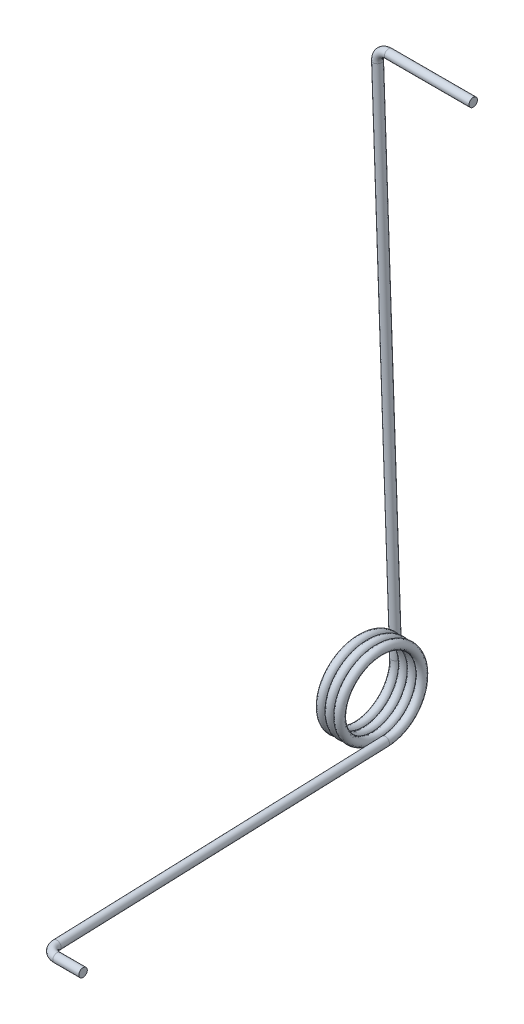
ISO-10303-21;
HEADER;
FILE_DESCRIPTION(('STEP AP214'),'2;1');
FILE_NAME('part.step','',(''),(''),'','','');
FILE_SCHEMA(('AUTOMOTIVE_DESIGN { 1 0 10303 214 1 1 1 1 }'));
ENDSEC;
DATA;
#1=APPLICATION_CONTEXT('core data for automotive mechanical design processes');
#2=APPLICATION_PROTOCOL_DEFINITION('international standard','automotive_design',2000,#1);
#3=PRODUCT_CONTEXT('',#1,'mechanical');
#4=PRODUCT('Part','Part','',(#3));
#5=PRODUCT_RELATED_PRODUCT_CATEGORY('part','',(#4));
#6=PRODUCT_DEFINITION_FORMATION('','',#4);
#7=PRODUCT_DEFINITION_CONTEXT('part definition',#1,'design');
#8=PRODUCT_DEFINITION('design','',#6,#7);
#9=PRODUCT_DEFINITION_SHAPE('','',#8);
#10=(LENGTH_UNIT() NAMED_UNIT(*) SI_UNIT(.MILLI.,.METRE.));
#11=(NAMED_UNIT(*) PLANE_ANGLE_UNIT() SI_UNIT($,.RADIAN.));
#12=(NAMED_UNIT(*) SI_UNIT($,.STERADIAN.) SOLID_ANGLE_UNIT());
#13=UNCERTAINTY_MEASURE_WITH_UNIT(LENGTH_MEASURE(1.E-05),#10,'distance_accuracy_value','');
#14=(GEOMETRIC_REPRESENTATION_CONTEXT(3) GLOBAL_UNCERTAINTY_ASSIGNED_CONTEXT((#13)) GLOBAL_UNIT_ASSIGNED_CONTEXT((#10,
#11,#12)) REPRESENTATION_CONTEXT('',''));
#15=CARTESIAN_POINT('',(0.,0.,0.));
#16=DIRECTION('',(0.,0.,1.));
#17=DIRECTION('',(1.,0.,0.));
#18=AXIS2_PLACEMENT_3D('',#15,#16,#17);
#19=CARTESIAN_POINT('',(0.48229322917672,0.0172046822200336,-4.4196));
#20=CARTESIAN_POINT('',(0.564843229176719,-2.53445256749044,-4.42953312791106));
#21=CARTESIAN_POINT('',(0.647393229176719,-3.81888353345569,-2.22469969186659));
#22=CARTESIAN_POINT('',(0.729943229176719,-5.10331449942094,-0.0198662558221171));
#23=CARTESIAN_POINT('',(0.812493229176719,-3.83608821567572,2.19490030813341));
#24=CARTESIAN_POINT('',(0.895043229176719,-2.56886193193051,4.40966687208894));
#25=CARTESIAN_POINT('',(0.977593229176719,-0.0172046822200342,4.4196));
#26=CARTESIAN_POINT('',(1.06014322917672,2.53445256749044,4.42953312791106));
#27=CARTESIAN_POINT('',(1.14269322917672,3.81888353345569,2.22469969186659));
#28=CARTESIAN_POINT('',(1.22524322917672,5.10331449942094,0.0198662558221177));
#29=CARTESIAN_POINT('',(1.30779322917672,3.83608821567572,-2.19490030813341));
#30=CARTESIAN_POINT('',(1.39034322917672,2.56886193193051,-4.40966687208894));
#31=CARTESIAN_POINT('',(1.47289322917672,0.0172046822200336,-4.4196));
#32=CARTESIAN_POINT('',(1.55544322917672,-2.53445256749044,-4.42953312791106));
#33=CARTESIAN_POINT('',(1.63799322917672,-3.81888353345569,-2.22469969186659));
#34=CARTESIAN_POINT('',(1.72054322917672,-5.10331449942094,-0.0198662558221171));
#35=CARTESIAN_POINT('',(1.80309322917672,-3.83608821567572,2.19490030813341));
#36=CARTESIAN_POINT('',(1.88564322917672,-2.56886193193051,4.40966687208894));
#37=CARTESIAN_POINT('',(1.96819322917672,-0.0172046822200342,4.4196));
#38=CARTESIAN_POINT('',(2.05074322917672,2.53445256749044,4.42953312791106));
#39=CARTESIAN_POINT('',(2.13329322917672,3.81888353345569,2.22469969186659));
#40=CARTESIAN_POINT('',(2.21584322917672,5.10331449942094,0.0198662558221177));
#41=CARTESIAN_POINT('',(2.29839322917672,3.83608821567572,-2.19490030813341));
#42=CARTESIAN_POINT('',(2.38094322917671,2.56886193193051,-4.40966687208894));
#43=CARTESIAN_POINT('',(2.46349322917672,0.0172046822200336,-4.4196));
#44=CARTESIAN_POINT('',(2.54604322917671,-2.53445256749044,-4.42953312791106));
#45=CARTESIAN_POINT('',(2.62859322917671,-3.81888353345569,-2.22469969186659));
#46=CARTESIAN_POINT('',(2.71114322917671,-5.10331449942094,-0.0198662558221171));
#47=CARTESIAN_POINT('',(2.79369322917671,-3.83608821567572,2.19490030813341));
#48=CARTESIAN_POINT('',(2.87624322917671,-2.56886193193051,4.40966687208894));
#49=CARTESIAN_POINT('',(2.95879322917671,-0.0172046822200342,4.4196));
#50=CARTESIAN_POINT('',(3.04134322917671,2.53445256749044,4.42953312791106));
#51=CARTESIAN_POINT('',(3.12389322917671,3.81888353345569,2.22469969186659));
#52=CARTESIAN_POINT('',(3.20644322917671,5.10331449942094,0.0198662558221177));
#53=CARTESIAN_POINT('',(3.28899322917671,3.83608821567572,-2.19490030813341));
#54=CARTESIAN_POINT('',(3.37154322917671,2.56886193193051,-4.40966687208894));
#55=CARTESIAN_POINT('',(3.45409322917671,0.0172046822200336,-4.4196));
#56=CARTESIAN_POINT('',(3.53664322917671,-2.53445256749044,-4.42953312791106));
#57=CARTESIAN_POINT('',(3.61919322917671,-3.81888353345569,-2.22469969186659));
#58=CARTESIAN_POINT('',(3.70174322917671,-5.10331449942094,-0.0198662558221171));
#59=CARTESIAN_POINT('',(3.78429322917671,-3.83608821567572,2.19490030813341));
#60=CARTESIAN_POINT('',(3.86684322917671,-2.56886193193051,4.40966687208894));
#61=CARTESIAN_POINT('',(3.94939322917671,-0.0172046822200342,4.4196));
#62=CARTESIAN_POINT('',(4.03194322917671,2.53445256749044,4.42953312791106));
#63=CARTESIAN_POINT('',(4.11449322917671,3.81888353345569,2.22469969186659));
#64=CARTESIAN_POINT('',(4.19704322917671,5.10331449942094,0.0198662558221177));
#65=CARTESIAN_POINT('',(4.27959322917671,3.83608821567572,-2.19490030813341));
#66=CARTESIAN_POINT('',(4.36214322917671,2.56886193193051,-4.40966687208894));
#67=CARTESIAN_POINT('',(4.44469322917671,0.0172046822200336,-4.4196));
#68=CARTESIAN_POINT('',(0.48229322917672,0.0172046822200336,-3.4544));
#69=CARTESIAN_POINT('',(0.564843229176719,-1.97719408766861,-3.46433312791106));
#70=CARTESIAN_POINT('',(0.647393229176719,-2.98299581372295,-1.74209969186659));
#71=CARTESIAN_POINT('',(0.729943229176719,-3.98879753977729,-0.019866255822117));
#72=CARTESIAN_POINT('',(0.812493229176719,-3.00020049594298,1.71230030813341));
#73=CARTESIAN_POINT('',(0.895043229176719,-2.01160345210868,3.44446687208894));
#74=CARTESIAN_POINT('',(0.977593229176719,-0.0172046822200341,3.4544));
#75=CARTESIAN_POINT('',(1.06014322917672,1.97719408766861,3.46433312791106));
#76=CARTESIAN_POINT('',(1.14269322917672,2.98299581372295,1.74209969186659));
#77=CARTESIAN_POINT('',(1.22524322917672,3.98879753977729,0.0198662558221175));
#78=CARTESIAN_POINT('',(1.30779322917672,3.00020049594298,-1.71230030813341));
#79=CARTESIAN_POINT('',(1.39034322917672,2.01160345210868,-3.44446687208894));
#80=CARTESIAN_POINT('',(1.47289322917672,0.0172046822200336,-3.4544));
#81=CARTESIAN_POINT('',(1.55544322917672,-1.97719408766861,-3.46433312791106));
#82=CARTESIAN_POINT('',(1.63799322917672,-2.98299581372295,-1.74209969186659));
#83=CARTESIAN_POINT('',(1.72054322917672,-3.98879753977729,-0.019866255822117));
#84=CARTESIAN_POINT('',(1.80309322917672,-3.00020049594298,1.71230030813341));
#85=CARTESIAN_POINT('',(1.88564322917672,-2.01160345210868,3.44446687208894));
#86=CARTESIAN_POINT('',(1.96819322917672,-0.0172046822200341,3.4544));
#87=CARTESIAN_POINT('',(2.05074322917672,1.97719408766861,3.46433312791106));
#88=CARTESIAN_POINT('',(2.13329322917672,2.98299581372295,1.74209969186659));
#89=CARTESIAN_POINT('',(2.21584322917672,3.98879753977729,0.0198662558221175));
#90=CARTESIAN_POINT('',(2.29839322917672,3.00020049594298,-1.71230030813341));
#91=CARTESIAN_POINT('',(2.38094322917672,2.01160345210868,-3.44446687208894));
#92=CARTESIAN_POINT('',(2.46349322917672,0.0172046822200336,-3.4544));
#93=CARTESIAN_POINT('',(2.54604322917671,-1.97719408766861,-3.46433312791106));
#94=CARTESIAN_POINT('',(2.62859322917671,-2.98299581372295,-1.74209969186659));
#95=CARTESIAN_POINT('',(2.71114322917671,-3.98879753977729,-0.019866255822117));
#96=CARTESIAN_POINT('',(2.79369322917671,-3.00020049594298,1.71230030813341));
#97=CARTESIAN_POINT('',(2.87624322917671,-2.01160345210868,3.44446687208894));
#98=CARTESIAN_POINT('',(2.95879322917671,-0.0172046822200341,3.4544));
#99=CARTESIAN_POINT('',(3.04134322917671,1.97719408766861,3.46433312791106));
#100=CARTESIAN_POINT('',(3.12389322917671,2.98299581372295,1.74209969186659));
#101=CARTESIAN_POINT('',(3.20644322917671,3.98879753977729,0.0198662558221175));
#102=CARTESIAN_POINT('',(3.28899322917671,3.00020049594298,-1.71230030813341));
#103=CARTESIAN_POINT('',(3.37154322917671,2.01160345210868,-3.44446687208894));
#104=CARTESIAN_POINT('',(3.45409322917671,0.0172046822200336,-3.4544));
#105=CARTESIAN_POINT('',(3.53664322917671,-1.97719408766861,-3.46433312791106));
#106=CARTESIAN_POINT('',(3.61919322917671,-2.98299581372295,-1.74209969186659));
#107=CARTESIAN_POINT('',(3.70174322917671,-3.98879753977729,-0.019866255822117));
#108=CARTESIAN_POINT('',(3.78429322917671,-3.00020049594298,1.71230030813341));
#109=CARTESIAN_POINT('',(3.86684322917671,-2.01160345210868,3.44446687208894));
#110=CARTESIAN_POINT('',(3.94939322917671,-0.0172046822200341,3.4544));
#111=CARTESIAN_POINT('',(4.03194322917671,1.97719408766861,3.46433312791106));
#112=CARTESIAN_POINT('',(4.11449322917671,2.98299581372295,1.74209969186659));
#113=CARTESIAN_POINT('',(4.19704322917671,3.98879753977729,0.0198662558221175));
#114=CARTESIAN_POINT('',(4.27959322917671,3.00020049594298,-1.71230030813341));
#115=CARTESIAN_POINT('',(4.36214322917671,2.01160345210868,-3.44446687208894));
#116=CARTESIAN_POINT('',(4.44469322917671,0.0172046822200336,-3.4544));
#117=CARTESIAN_POINT('',(-0.482293229176719,-0.0172046822200336,-3.4544));
#118=CARTESIAN_POINT('',(-0.39974322917672,-2.01160345210868,-3.44446687208894));
#119=CARTESIAN_POINT('',(-0.31719322917672,-3.00020049594298,-1.71230030813341));
#120=CARTESIAN_POINT('',(-0.23464322917672,-3.98879753977729,0.0198662558221165));
#121=CARTESIAN_POINT('',(-0.15209322917672,-2.98299581372295,1.74209969186659));
#122=CARTESIAN_POINT('',(-0.0695432291767204,-1.97719408766861,3.46433312791106));
#123=CARTESIAN_POINT('',(0.0130067708232794,0.0172046822200332,3.4544));
#124=CARTESIAN_POINT('',(0.0955567708232792,2.01160345210868,3.44446687208894));
#125=CARTESIAN_POINT('',(0.178106770823279,3.00020049594298,1.71230030813341));
#126=CARTESIAN_POINT('',(0.260656770823279,3.98879753977729,-0.0198662558221161));
#127=CARTESIAN_POINT('',(0.343206770823279,2.98299581372295,-1.74209969186659));
#128=CARTESIAN_POINT('',(0.425756770823279,1.97719408766861,-3.46433312791106));
#129=CARTESIAN_POINT('',(0.508306770823278,-0.0172046822200336,-3.4544));
#130=CARTESIAN_POINT('',(0.590856770823278,-2.01160345210868,-3.44446687208894));
#131=CARTESIAN_POINT('',(0.673406770823278,-3.00020049594298,-1.71230030813341));
#132=CARTESIAN_POINT('',(0.755956770823278,-3.98879753977729,0.0198662558221165));
#133=CARTESIAN_POINT('',(0.838506770823278,-2.98299581372295,1.74209969186659));
#134=CARTESIAN_POINT('',(0.921056770823277,-1.97719408766861,3.46433312791106));
#135=CARTESIAN_POINT('',(1.00360677082328,0.0172046822200332,3.4544));
#136=CARTESIAN_POINT('',(1.08615677082328,2.01160345210868,3.44446687208894));
#137=CARTESIAN_POINT('',(1.16870677082328,3.00020049594298,1.71230030813341));
#138=CARTESIAN_POINT('',(1.25125677082328,3.98879753977729,-0.0198662558221161));
#139=CARTESIAN_POINT('',(1.33380677082328,2.98299581372295,-1.74209969186659));
#140=CARTESIAN_POINT('',(1.41635677082328,1.97719408766861,-3.46433312791106));
#141=CARTESIAN_POINT('',(1.49890677082328,-0.0172046822200336,-3.4544));
#142=CARTESIAN_POINT('',(1.58145677082328,-2.01160345210868,-3.44446687208894));
#143=CARTESIAN_POINT('',(1.66400677082328,-3.00020049594298,-1.71230030813341));
#144=CARTESIAN_POINT('',(1.74655677082328,-3.98879753977729,0.0198662558221165));
#145=CARTESIAN_POINT('',(1.82910677082328,-2.98299581372295,1.74209969186659));
#146=CARTESIAN_POINT('',(1.91165677082328,-1.97719408766861,3.46433312791106));
#147=CARTESIAN_POINT('',(1.99420677082328,0.0172046822200332,3.4544));
#148=CARTESIAN_POINT('',(2.07675677082328,2.01160345210868,3.44446687208894));
#149=CARTESIAN_POINT('',(2.15930677082327,3.00020049594298,1.71230030813341));
#150=CARTESIAN_POINT('',(2.24185677082327,3.98879753977729,-0.0198662558221161));
#151=CARTESIAN_POINT('',(2.32440677082327,2.98299581372295,-1.74209969186659));
#152=CARTESIAN_POINT('',(2.40695677082327,1.97719408766861,-3.46433312791106));
#153=CARTESIAN_POINT('',(2.48950677082327,-0.0172046822200336,-3.4544));
#154=CARTESIAN_POINT('',(2.57205677082327,-2.01160345210868,-3.44446687208894));
#155=CARTESIAN_POINT('',(2.65460677082327,-3.00020049594298,-1.71230030813341));
#156=CARTESIAN_POINT('',(2.73715677082327,-3.98879753977729,0.0198662558221165));
#157=CARTESIAN_POINT('',(2.81970677082327,-2.98299581372295,1.74209969186659));
#158=CARTESIAN_POINT('',(2.90225677082327,-1.97719408766861,3.46433312791106));
#159=CARTESIAN_POINT('',(2.98480677082327,0.0172046822200332,3.4544));
#160=CARTESIAN_POINT('',(3.06735677082327,2.01160345210868,3.44446687208894));
#161=CARTESIAN_POINT('',(3.14990677082327,3.00020049594298,1.71230030813341));
#162=CARTESIAN_POINT('',(3.23245677082327,3.98879753977729,-0.0198662558221161));
#163=CARTESIAN_POINT('',(3.31500677082327,2.98299581372295,-1.74209969186659));
#164=CARTESIAN_POINT('',(3.39755677082327,1.97719408766861,-3.46433312791106));
#165=CARTESIAN_POINT('',(3.48010677082327,-0.0172046822200336,-3.4544));
#166=CARTESIAN_POINT('',(-0.48229322917672,-0.0172046822200336,-4.4196));
#167=CARTESIAN_POINT('',(-0.39974322917672,-2.5688619319305,-4.40966687208894));
#168=CARTESIAN_POINT('',(-0.31719322917672,-3.83608821567572,-2.19490030813341));
#169=CARTESIAN_POINT('',(-0.23464322917672,-5.10331449942094,0.0198662558221165));
#170=CARTESIAN_POINT('',(-0.15209322917672,-3.81888353345569,2.22469969186659));
#171=CARTESIAN_POINT('',(-0.0695432291767205,-2.53445256749044,4.42953312791106));
#172=CARTESIAN_POINT('',(0.0130067708232793,0.0172046822200331,4.4196));
#173=CARTESIAN_POINT('',(0.0955567708232791,2.5688619319305,4.40966687208894));
#174=CARTESIAN_POINT('',(0.178106770823279,3.83608821567572,2.19490030813342));
#175=CARTESIAN_POINT('',(0.260656770823279,5.10331449942094,-0.0198662558221159));
#176=CARTESIAN_POINT('',(0.343206770823279,3.81888353345569,-2.22469969186659));
#177=CARTESIAN_POINT('',(0.425756770823278,2.53445256749044,-4.42953312791106));
#178=CARTESIAN_POINT('',(0.508306770823278,-0.0172046822200336,-4.4196));
#179=CARTESIAN_POINT('',(0.590856770823278,-2.5688619319305,-4.40966687208894));
#180=CARTESIAN_POINT('',(0.673406770823278,-3.83608821567572,-2.19490030813341));
#181=CARTESIAN_POINT('',(0.755956770823278,-5.10331449942094,0.0198662558221165));
#182=CARTESIAN_POINT('',(0.838506770823277,-3.81888353345569,2.22469969186659));
#183=CARTESIAN_POINT('',(0.921056770823277,-2.53445256749044,4.42953312791106));
#184=CARTESIAN_POINT('',(1.00360677082328,0.0172046822200331,4.4196));
#185=CARTESIAN_POINT('',(1.08615677082328,2.5688619319305,4.40966687208894));
#186=CARTESIAN_POINT('',(1.16870677082328,3.83608821567572,2.19490030813342));
#187=CARTESIAN_POINT('',(1.25125677082328,5.10331449942094,-0.0198662558221159));
#188=CARTESIAN_POINT('',(1.33380677082328,3.81888353345569,-2.22469969186659));
#189=CARTESIAN_POINT('',(1.41635677082328,2.53445256749044,-4.42953312791106));
#190=CARTESIAN_POINT('',(1.49890677082328,-0.0172046822200336,-4.4196));
#191=CARTESIAN_POINT('',(1.58145677082328,-2.5688619319305,-4.40966687208894));
#192=CARTESIAN_POINT('',(1.66400677082328,-3.83608821567572,-2.19490030813341));
#193=CARTESIAN_POINT('',(1.74655677082328,-5.10331449942094,0.0198662558221165));
#194=CARTESIAN_POINT('',(1.82910677082328,-3.81888353345569,2.22469969186659));
#195=CARTESIAN_POINT('',(1.91165677082327,-2.53445256749044,4.42953312791106));
#196=CARTESIAN_POINT('',(1.99420677082327,0.0172046822200331,4.4196));
#197=CARTESIAN_POINT('',(2.07675677082327,2.5688619319305,4.40966687208894));
#198=CARTESIAN_POINT('',(2.15930677082327,3.83608821567572,2.19490030813342));
#199=CARTESIAN_POINT('',(2.24185677082327,5.10331449942094,-0.0198662558221159));
#200=CARTESIAN_POINT('',(2.32440677082327,3.81888353345569,-2.22469969186659));
#201=CARTESIAN_POINT('',(2.40695677082327,2.53445256749044,-4.42953312791106));
#202=CARTESIAN_POINT('',(2.48950677082327,-0.0172046822200336,-4.4196));
#203=CARTESIAN_POINT('',(2.57205677082327,-2.5688619319305,-4.40966687208894));
#204=CARTESIAN_POINT('',(2.65460677082327,-3.83608821567572,-2.19490030813341));
#205=CARTESIAN_POINT('',(2.73715677082327,-5.10331449942094,0.0198662558221165));
#206=CARTESIAN_POINT('',(2.81970677082327,-3.81888353345569,2.22469969186659));
#207=CARTESIAN_POINT('',(2.90225677082327,-2.53445256749044,4.42953312791106));
#208=CARTESIAN_POINT('',(2.98480677082327,0.0172046822200331,4.4196));
#209=CARTESIAN_POINT('',(3.06735677082327,2.5688619319305,4.40966687208894));
#210=CARTESIAN_POINT('',(3.14990677082327,3.83608821567572,2.19490030813342));
#211=CARTESIAN_POINT('',(3.23245677082327,5.10331449942094,-0.0198662558221159));
#212=CARTESIAN_POINT('',(3.31500677082327,3.81888353345569,-2.22469969186659));
#213=CARTESIAN_POINT('',(3.39755677082327,2.53445256749044,-4.42953312791106));
#214=CARTESIAN_POINT('',(3.48010677082327,-0.0172046822200336,-4.4196));
#215=CARTESIAN_POINT('',(-0.48229322917672,-0.0172046822200337,-5.3848));
#216=CARTESIAN_POINT('',(-0.39974322917672,-3.12612041175233,-5.37486687208894));
#217=CARTESIAN_POINT('',(-0.31719322917672,-4.67197593540846,-2.67750030813341));
#218=CARTESIAN_POINT('',(-0.23464322917672,-6.2178314590646,0.0198662558221164));
#219=CARTESIAN_POINT('',(-0.15209322917672,-4.65477125318843,2.70729969186659));
#220=CARTESIAN_POINT('',(-0.0695432291767207,-3.09171104731227,5.39473312791106));
#221=CARTESIAN_POINT('',(0.0130067708232792,0.017204682220033,5.3848));
#222=CARTESIAN_POINT('',(0.095556770823279,3.12612041175233,5.37486687208894));
#223=CARTESIAN_POINT('',(0.178106770823279,4.67197593540846,2.67750030813342));
#224=CARTESIAN_POINT('',(0.260656770823279,6.2178314590646,-0.0198662558221157));
#225=CARTESIAN_POINT('',(0.343206770823278,4.65477125318843,-2.70729969186658));
#226=CARTESIAN_POINT('',(0.425756770823278,3.09171104731227,-5.39473312791106));
#227=CARTESIAN_POINT('',(0.508306770823278,-0.0172046822200337,-5.3848));
#228=CARTESIAN_POINT('',(0.590856770823278,-3.12612041175233,-5.37486687208894));
#229=CARTESIAN_POINT('',(0.673406770823278,-4.67197593540846,-2.67750030813341));
#230=CARTESIAN_POINT('',(0.755956770823278,-6.2178314590646,0.0198662558221164));
#231=CARTESIAN_POINT('',(0.838506770823277,-4.65477125318843,2.70729969186659));
#232=CARTESIAN_POINT('',(0.921056770823277,-3.09171104731227,5.39473312791106));
#233=CARTESIAN_POINT('',(1.00360677082328,0.017204682220033,5.3848));
#234=CARTESIAN_POINT('',(1.08615677082328,3.12612041175233,5.37486687208894));
#235=CARTESIAN_POINT('',(1.16870677082328,4.67197593540846,2.67750030813342));
#236=CARTESIAN_POINT('',(1.25125677082328,6.2178314590646,-0.0198662558221157));
#237=CARTESIAN_POINT('',(1.33380677082328,4.65477125318843,-2.70729969186658));
#238=CARTESIAN_POINT('',(1.41635677082328,3.09171104731227,-5.39473312791106));
#239=CARTESIAN_POINT('',(1.49890677082328,-0.0172046822200337,-5.3848));
#240=CARTESIAN_POINT('',(1.58145677082328,-3.12612041175233,-5.37486687208894));
#241=CARTESIAN_POINT('',(1.66400677082328,-4.67197593540846,-2.67750030813341));
#242=CARTESIAN_POINT('',(1.74655677082328,-6.2178314590646,0.0198662558221164));
#243=CARTESIAN_POINT('',(1.82910677082328,-4.65477125318843,2.70729969186659));
#244=CARTESIAN_POINT('',(1.91165677082328,-3.09171104731227,5.39473312791106));
#245=CARTESIAN_POINT('',(1.99420677082327,0.017204682220033,5.3848));
#246=CARTESIAN_POINT('',(2.07675677082327,3.12612041175233,5.37486687208894));
#247=CARTESIAN_POINT('',(2.15930677082327,4.67197593540846,2.67750030813342));
#248=CARTESIAN_POINT('',(2.24185677082327,6.2178314590646,-0.0198662558221157));
#249=CARTESIAN_POINT('',(2.32440677082327,4.65477125318843,-2.70729969186658));
#250=CARTESIAN_POINT('',(2.40695677082327,3.09171104731227,-5.39473312791106));
#251=CARTESIAN_POINT('',(2.48950677082327,-0.0172046822200337,-5.3848));
#252=CARTESIAN_POINT('',(2.57205677082327,-3.12612041175233,-5.37486687208894));
#253=CARTESIAN_POINT('',(2.65460677082327,-4.67197593540846,-2.67750030813341));
#254=CARTESIAN_POINT('',(2.73715677082327,-6.2178314590646,0.0198662558221164));
#255=CARTESIAN_POINT('',(2.81970677082327,-4.65477125318843,2.70729969186659));
#256=CARTESIAN_POINT('',(2.90225677082327,-3.09171104731227,5.39473312791106));
#257=CARTESIAN_POINT('',(2.98480677082327,0.017204682220033,5.3848));
#258=CARTESIAN_POINT('',(3.06735677082327,3.12612041175233,5.37486687208894));
#259=CARTESIAN_POINT('',(3.14990677082327,4.67197593540846,2.67750030813342));
#260=CARTESIAN_POINT('',(3.23245677082327,6.2178314590646,-0.0198662558221157));
#261=CARTESIAN_POINT('',(3.31500677082327,4.65477125318843,-2.70729969186658));
#262=CARTESIAN_POINT('',(3.39755677082327,3.09171104731227,-5.39473312791106));
#263=CARTESIAN_POINT('',(3.48010677082327,-0.0172046822200337,-5.3848));
#264=CARTESIAN_POINT('',(0.48229322917672,0.0172046822200336,-5.3848));
#265=CARTESIAN_POINT('',(0.564843229176719,-3.09171104731226,-5.39473312791106));
#266=CARTESIAN_POINT('',(0.647393229176719,-4.65477125318843,-2.70729969186659));
#267=CARTESIAN_POINT('',(0.729943229176719,-6.2178314590646,-0.0198662558221172));
#268=CARTESIAN_POINT('',(0.812493229176719,-4.67197593540846,2.67750030813341));
#269=CARTESIAN_POINT('',(0.895043229176719,-3.12612041175233,5.37486687208894));
#270=CARTESIAN_POINT('',(0.977593229176719,-0.0172046822200343,5.3848));
#271=CARTESIAN_POINT('',(1.06014322917672,3.09171104731226,5.39473312791106));
#272=CARTESIAN_POINT('',(1.14269322917672,4.65477125318843,2.70729969186659));
#273=CARTESIAN_POINT('',(1.22524322917672,6.2178314590646,0.0198662558221179));
#274=CARTESIAN_POINT('',(1.30779322917672,4.67197593540847,-2.67750030813341));
#275=CARTESIAN_POINT('',(1.39034322917672,3.12612041175234,-5.37486687208894));
#276=CARTESIAN_POINT('',(1.47289322917672,0.0172046822200336,-5.3848));
#277=CARTESIAN_POINT('',(1.55544322917672,-3.09171104731226,-5.39473312791106));
#278=CARTESIAN_POINT('',(1.63799322917672,-4.65477125318843,-2.70729969186659));
#279=CARTESIAN_POINT('',(1.72054322917672,-6.2178314590646,-0.0198662558221172));
#280=CARTESIAN_POINT('',(1.80309322917672,-4.67197593540846,2.67750030813341));
#281=CARTESIAN_POINT('',(1.88564322917672,-3.12612041175233,5.37486687208894));
#282=CARTESIAN_POINT('',(1.96819322917672,-0.0172046822200343,5.3848));
#283=CARTESIAN_POINT('',(2.05074322917672,3.09171104731226,5.39473312791106));
#284=CARTESIAN_POINT('',(2.13329322917672,4.65477125318843,2.70729969186659));
#285=CARTESIAN_POINT('',(2.21584322917672,6.2178314590646,0.0198662558221179));
#286=CARTESIAN_POINT('',(2.29839322917672,4.67197593540847,-2.67750030813341));
#287=CARTESIAN_POINT('',(2.38094322917672,3.12612041175234,-5.37486687208894));
#288=CARTESIAN_POINT('',(2.46349322917672,0.0172046822200336,-5.3848));
#289=CARTESIAN_POINT('',(2.54604322917671,-3.09171104731226,-5.39473312791106));
#290=CARTESIAN_POINT('',(2.62859322917671,-4.65477125318843,-2.70729969186659));
#291=CARTESIAN_POINT('',(2.71114322917671,-6.2178314590646,-0.0198662558221172));
#292=CARTESIAN_POINT('',(2.79369322917671,-4.67197593540846,2.67750030813341));
#293=CARTESIAN_POINT('',(2.87624322917671,-3.12612041175233,5.37486687208894));
#294=CARTESIAN_POINT('',(2.95879322917671,-0.0172046822200343,5.3848));
#295=CARTESIAN_POINT('',(3.04134322917671,3.09171104731226,5.39473312791106));
#296=CARTESIAN_POINT('',(3.12389322917671,4.65477125318843,2.70729969186659));
#297=CARTESIAN_POINT('',(3.20644322917671,6.2178314590646,0.0198662558221179));
#298=CARTESIAN_POINT('',(3.28899322917671,4.67197593540847,-2.67750030813341));
#299=CARTESIAN_POINT('',(3.37154322917671,3.12612041175234,-5.37486687208894));
#300=CARTESIAN_POINT('',(3.45409322917671,0.0172046822200336,-5.3848));
#301=CARTESIAN_POINT('',(3.53664322917671,-3.09171104731226,-5.39473312791106));
#302=CARTESIAN_POINT('',(3.61919322917671,-4.65477125318843,-2.70729969186659));
#303=CARTESIAN_POINT('',(3.70174322917671,-6.2178314590646,-0.0198662558221172));
#304=CARTESIAN_POINT('',(3.78429322917671,-4.67197593540846,2.67750030813341));
#305=CARTESIAN_POINT('',(3.86684322917671,-3.12612041175233,5.37486687208894));
#306=CARTESIAN_POINT('',(3.94939322917671,-0.0172046822200343,5.3848));
#307=CARTESIAN_POINT('',(4.03194322917671,3.09171104731226,5.39473312791106));
#308=CARTESIAN_POINT('',(4.11449322917671,4.65477125318843,2.70729969186659));
#309=CARTESIAN_POINT('',(4.19704322917671,6.2178314590646,0.0198662558221179));
#310=CARTESIAN_POINT('',(4.27959322917671,4.67197593540847,-2.67750030813341));
#311=CARTESIAN_POINT('',(4.36214322917671,3.12612041175234,-5.37486687208894));
#312=CARTESIAN_POINT('',(4.44469322917671,0.0172046822200336,-5.3848));
#313=CARTESIAN_POINT('',(0.48229322917672,0.0172046822200336,-4.4196));
#314=CARTESIAN_POINT('',(0.564843229176719,-2.53445256749044,-4.42953312791106));
#315=CARTESIAN_POINT('',(0.647393229176719,-3.81888353345569,-2.22469969186659));
#316=CARTESIAN_POINT('',(0.729943229176719,-5.10331449942094,-0.0198662558221171));
#317=CARTESIAN_POINT('',(0.812493229176719,-3.83608821567572,2.19490030813341));
#318=CARTESIAN_POINT('',(0.895043229176719,-2.56886193193051,4.40966687208894));
#319=CARTESIAN_POINT('',(0.977593229176719,-0.0172046822200342,4.4196));
#320=CARTESIAN_POINT('',(1.06014322917672,2.53445256749044,4.42953312791106));
#321=CARTESIAN_POINT('',(1.14269322917672,3.81888353345569,2.22469969186659));
#322=CARTESIAN_POINT('',(1.22524322917672,5.10331449942094,0.0198662558221177));
#323=CARTESIAN_POINT('',(1.30779322917672,3.83608821567572,-2.19490030813341));
#324=CARTESIAN_POINT('',(1.39034322917672,2.56886193193051,-4.40966687208894));
#325=CARTESIAN_POINT('',(1.47289322917672,0.0172046822200336,-4.4196));
#326=CARTESIAN_POINT('',(1.55544322917672,-2.53445256749044,-4.42953312791106));
#327=CARTESIAN_POINT('',(1.63799322917672,-3.81888353345569,-2.22469969186659));
#328=CARTESIAN_POINT('',(1.72054322917672,-5.10331449942094,-0.0198662558221171));
#329=CARTESIAN_POINT('',(1.80309322917672,-3.83608821567572,2.19490030813341));
#330=CARTESIAN_POINT('',(1.88564322917672,-2.56886193193051,4.40966687208894));
#331=CARTESIAN_POINT('',(1.96819322917672,-0.0172046822200342,4.4196));
#332=CARTESIAN_POINT('',(2.05074322917672,2.53445256749044,4.42953312791106));
#333=CARTESIAN_POINT('',(2.13329322917672,3.81888353345569,2.22469969186659));
#334=CARTESIAN_POINT('',(2.21584322917672,5.10331449942094,0.0198662558221177));
#335=CARTESIAN_POINT('',(2.29839322917672,3.83608821567572,-2.19490030813341));
#336=CARTESIAN_POINT('',(2.38094322917671,2.56886193193051,-4.40966687208894));
#337=CARTESIAN_POINT('',(2.46349322917672,0.0172046822200336,-4.4196));
#338=CARTESIAN_POINT('',(2.54604322917671,-2.53445256749044,-4.42953312791106));
#339=CARTESIAN_POINT('',(2.62859322917671,-3.81888353345569,-2.22469969186659));
#340=CARTESIAN_POINT('',(2.71114322917671,-5.10331449942094,-0.0198662558221171));
#341=CARTESIAN_POINT('',(2.79369322917671,-3.83608821567572,2.19490030813341));
#342=CARTESIAN_POINT('',(2.87624322917671,-2.56886193193051,4.40966687208894));
#343=CARTESIAN_POINT('',(2.95879322917671,-0.0172046822200342,4.4196));
#344=CARTESIAN_POINT('',(3.04134322917671,2.53445256749044,4.42953312791106));
#345=CARTESIAN_POINT('',(3.12389322917671,3.81888353345569,2.22469969186659));
#346=CARTESIAN_POINT('',(3.20644322917671,5.10331449942094,0.0198662558221177));
#347=CARTESIAN_POINT('',(3.28899322917671,3.83608821567572,-2.19490030813341));
#348=CARTESIAN_POINT('',(3.37154322917671,2.56886193193051,-4.40966687208894));
#349=CARTESIAN_POINT('',(3.45409322917671,0.0172046822200336,-4.4196));
#350=CARTESIAN_POINT('',(3.53664322917671,-2.53445256749044,-4.42953312791106));
#351=CARTESIAN_POINT('',(3.61919322917671,-3.81888353345569,-2.22469969186659));
#352=CARTESIAN_POINT('',(3.70174322917671,-5.10331449942094,-0.0198662558221171));
#353=CARTESIAN_POINT('',(3.78429322917671,-3.83608821567572,2.19490030813341));
#354=CARTESIAN_POINT('',(3.86684322917671,-2.56886193193051,4.40966687208894));
#355=CARTESIAN_POINT('',(3.94939322917671,-0.0172046822200342,4.4196));
#356=CARTESIAN_POINT('',(4.03194322917671,2.53445256749044,4.42953312791106));
#357=CARTESIAN_POINT('',(4.11449322917671,3.81888353345569,2.22469969186659));
#358=CARTESIAN_POINT('',(4.19704322917671,5.10331449942094,0.0198662558221177));
#359=CARTESIAN_POINT('',(4.27959322917671,3.83608821567572,-2.19490030813341));
#360=CARTESIAN_POINT('',(4.36214322917671,2.56886193193051,-4.40966687208894));
#361=CARTESIAN_POINT('',(4.44469322917671,0.0172046822200336,-4.4196));
#362=(BOUNDED_SURFACE() B_SPLINE_SURFACE(3,2,((#19,#20,#21,#22,#23,#24,#25,#26,#27,#28,#29,#30,
#31,#32,#33,#34,#35,#36,#37,#38,#39,#40,#41,#42,#43,#44,#45,#46,#47,#48,#49,#50,#51,#52,#53,#54,
#55,#56,#57,#58,#59,#60,#61,#62,#63,#64,#65,#66,#67),(#68,#69,#70,#71,#72,#73,#74,#75,#76,#77,
#78,#79,#80,#81,#82,#83,#84,#85,#86,#87,#88,#89,#90,#91,#92,#93,#94,#95,#96,#97,#98,#99,#100,
#101,#102,#103,#104,#105,#106,#107,#108,#109,#110,#111,#112,#113,#114,#115,#116),(#117,#118,
#119,#120,#121,#122,#123,#124,#125,#126,#127,#128,#129,#130,#131,#132,#133,#134,#135,#136,#137,
#138,#139,#140,#141,#142,#143,#144,#145,#146,#147,#148,#149,#150,#151,#152,#153,#154,#155,#156,
#157,#158,#159,#160,#161,#162,#163,#164,#165),(#166,#167,#168,#169,#170,#171,#172,#173,#174,
#175,#176,#177,#178,#179,#180,#181,#182,#183,#184,#185,#186,#187,#188,#189,#190,#191,#192,#193,
#194,#195,#196,#197,#198,#199,#200,#201,#202,#203,#204,#205,#206,#207,#208,#209,#210,#211,#212,
#213,#214),(#215,#216,#217,#218,#219,#220,#221,#222,#223,#224,#225,#226,#227,#228,#229,#230,
#231,#232,#233,#234,#235,#236,#237,#238,#239,#240,#241,#242,#243,#244,#245,#246,#247,#248,#249,
#250,#251,#252,#253,#254,#255,#256,#257,#258,#259,#260,#261,#262,#263),(#264,#265,#266,#267,
#268,#269,#270,#271,#272,#273,#274,#275,#276,#277,#278,#279,#280,#281,#282,#283,#284,#285,#286,
#287,#288,#289,#290,#291,#292,#293,#294,#295,#296,#297,#298,#299,#300,#301,#302,#303,#304,#305,
#306,#307,#308,#309,#310,#311,#312),(#313,#314,#315,#316,#317,#318,#319,#320,#321,#322,#323,
#324,#325,#326,#327,#328,#329,#330,#331,#332,#333,#334,#335,#336,#337,#338,#339,#340,#341,#342,
#343,#344,#345,#346,#347,#348,#349,#350,#351,#352,#353,#354,#355,#356,#357,#358,#359,#360,
#361)),.UNSPECIFIED.,.T.,.F.,.F.) B_SPLINE_SURFACE_WITH_KNOTS((4,3,4),(3,2,2,2,2,2,2,2,2,2,2,2,
2,2,2,2,2,2,2,2,2,2,2,2,3),(0.,0.5,1.),(0.,0.0416666666666667,0.0833333333333333,0.125,
0.166666666666667,0.208333333333333,0.25,0.291666666666667,0.333333333333333,0.375,
0.416666666666667,0.458333333333333,0.5,0.541666666666667,0.583333333333333,0.625,
0.666666666666667,0.708333333333333,0.75,0.791666666666667,0.833333333333333,0.875,
0.916666666666667,0.958333333333333,1.),
.UNSPECIFIED.) GEOMETRIC_REPRESENTATION_ITEM() RATIONAL_B_SPLINE_SURFACE(((1.,0.866025403784439,
1.,0.866025403784439,1.,0.866025403784439,1.,0.866025403784439,1.,0.866025403784439,1.,
0.866025403784439,1.,0.866025403784439,1.,0.866025403784439,1.,0.866025403784439,1.,
0.866025403784439,1.,0.866025403784439,1.,0.866025403784439,1.,0.866025403784439,1.,
0.866025403784439,1.,0.866025403784439,1.,0.866025403784439,1.,0.866025403784439,1.,
0.866025403784439,1.,0.866025403784439,1.,0.866025403784439,1.,0.866025403784439,1.,
0.866025403784439,1.,0.866025403784439,1.,0.866025403784439,1.),(0.333333333333333,
0.288675134594813,0.333333333333333,0.288675134594813,0.333333333333333,0.288675134594813,
0.333333333333333,0.288675134594813,0.333333333333333,0.288675134594813,0.333333333333333,
0.288675134594813,0.333333333333333,0.288675134594813,0.333333333333333,0.288675134594813,
0.333333333333333,0.288675134594813,0.333333333333333,0.288675134594813,0.333333333333333,
0.288675134594813,0.333333333333333,0.288675134594813,0.333333333333333,0.288675134594813,
0.333333333333333,0.288675134594813,0.333333333333333,0.288675134594813,0.333333333333333,
0.288675134594813,0.333333333333333,0.288675134594813,0.333333333333333,0.288675134594813,
0.333333333333333,0.288675134594813,0.333333333333333,0.288675134594813,0.333333333333333,
0.288675134594813,0.333333333333333,0.288675134594813,0.333333333333333,0.288675134594813,
0.333333333333333,0.288675134594813,0.333333333333333),(0.333333333333333,0.288675134594813,
0.333333333333333,0.288675134594813,0.333333333333333,0.288675134594813,0.333333333333333,
0.288675134594813,0.333333333333333,0.288675134594813,0.333333333333333,0.288675134594813,
0.333333333333333,0.288675134594813,0.333333333333333,0.288675134594813,0.333333333333333,
0.288675134594813,0.333333333333333,0.288675134594813,0.333333333333333,0.288675134594813,
0.333333333333333,0.288675134594813,0.333333333333333,0.288675134594813,0.333333333333333,
0.288675134594813,0.333333333333333,0.288675134594813,0.333333333333333,0.288675134594813,
0.333333333333333,0.288675134594813,0.333333333333333,0.288675134594813,0.333333333333333,
0.288675134594813,0.333333333333333,0.288675134594813,0.333333333333333,0.288675134594813,
0.333333333333333,0.288675134594813,0.333333333333333,0.288675134594813,0.333333333333333,
0.288675134594813,0.333333333333333),(1.,0.866025403784439,1.,0.866025403784439,1.,
0.866025403784439,1.,0.866025403784439,1.,0.866025403784439,1.,0.866025403784439,1.,
0.866025403784439,1.,0.866025403784439,1.,0.866025403784439,1.,0.866025403784439,1.,
0.866025403784439,1.,0.866025403784439,1.,0.866025403784439,1.,0.866025403784439,1.,
0.866025403784439,1.,0.866025403784439,1.,0.866025403784439,1.,0.866025403784439,1.,
0.866025403784439,1.,0.866025403784439,1.,0.866025403784439,1.,0.866025403784439,1.,
0.866025403784439,1.,0.866025403784439,1.),(0.333333333333333,0.288675134594813,
0.333333333333333,0.288675134594813,0.333333333333333,0.288675134594813,0.333333333333333,
0.288675134594813,0.333333333333333,0.288675134594813,0.333333333333333,0.288675134594813,
0.333333333333333,0.288675134594813,0.333333333333333,0.288675134594813,0.333333333333333,
0.288675134594813,0.333333333333333,0.288675134594813,0.333333333333333,0.288675134594813,
0.333333333333333,0.288675134594813,0.333333333333333,0.288675134594813,0.333333333333333,
0.288675134594813,0.333333333333333,0.288675134594813,0.333333333333333,0.288675134594813,
0.333333333333333,0.288675134594813,0.333333333333333,0.288675134594813,0.333333333333333,
0.288675134594813,0.333333333333333,0.288675134594813,0.333333333333333,0.288675134594813,
0.333333333333333,0.288675134594813,0.333333333333333,0.288675134594813,0.333333333333333,
0.288675134594813,0.333333333333333),(0.333333333333333,0.288675134594813,0.333333333333333,
0.288675134594813,0.333333333333333,0.288675134594813,0.333333333333333,0.288675134594813,
0.333333333333333,0.288675134594813,0.333333333333333,0.288675134594813,0.333333333333333,
0.288675134594813,0.333333333333333,0.288675134594813,0.333333333333333,0.288675134594813,
0.333333333333333,0.288675134594813,0.333333333333333,0.288675134594813,0.333333333333333,
0.288675134594813,0.333333333333333,0.288675134594813,0.333333333333333,0.288675134594813,
0.333333333333333,0.288675134594813,0.333333333333333,0.288675134594813,0.333333333333333,
0.288675134594813,0.333333333333333,0.288675134594813,0.333333333333333,0.288675134594813,
0.333333333333333,0.288675134594813,0.333333333333333,0.288675134594813,0.333333333333333,
0.288675134594813,0.333333333333333,0.288675134594813,0.333333333333333,0.288675134594813,
0.333333333333333),(1.,0.866025403784439,1.,0.866025403784439,1.,0.866025403784439,1.,
0.866025403784439,1.,0.866025403784439,1.,0.866025403784439,1.,0.866025403784439,1.,
0.866025403784439,1.,0.866025403784439,1.,0.866025403784439,1.,0.866025403784439,1.,
0.866025403784439,1.,0.866025403784439,1.,0.866025403784439,1.,0.866025403784439,1.,
0.866025403784439,1.,0.866025403784439,1.,0.866025403784439,1.,0.866025403784439,1.,
0.866025403784439,1.,0.866025403784439,1.,0.866025403784439,1.,0.866025403784439,1.,
0.866025403784439,1.))) REPRESENTATION_ITEM('') SURFACE());
#363=CARTESIAN_POINT('',(3.21945,-4.4196,1.92751575339551E-13));
#364=DIRECTION('',(0.0356499838790585,0.,0.999364337291172));
#365=DIRECTION('',(0.999364337291172,0.,-0.0356499838790585));
#366=AXIS2_PLACEMENT_3D('',#363,#364,#365);
#367=CIRCLE('',#366,0.4826);
#368=CARTESIAN_POINT('',(3.70174322917672,-4.4196,-0.0172046822198409));
#369=VERTEX_POINT('',#368);
#370=EDGE_CURVE('E10',#369,#369,#367,.T.);
#371=CARTESIAN_POINT('',(0.,0.,-4.4196));
#372=DIRECTION('',(0.0356499838790585,-0.999364337291172,0.));
#373=DIRECTION('',(0.999364337291172,0.0356499838790585,0.));
#374=AXIS2_PLACEMENT_3D('',#371,#372,#373);
#375=CIRCLE('',#374,0.4826);
#376=CARTESIAN_POINT('',(0.48229322917672,0.0172046822200336,-4.4196));
#377=VERTEX_POINT('',#376);
#378=EDGE_CURVE('E39',#377,#377,#375,.T.);
#379=ORIENTED_EDGE('',*,*,#370,.F.);
#380=EDGE_LOOP('',(#379));
#381=FACE_BOUND('',#380,.T.);
#382=ORIENTED_EDGE('',*,*,#378,.T.);
#383=EDGE_LOOP('',(#382));
#384=FACE_BOUND('',#383,.T.);
#385=ADVANCED_FACE('F31',(#381,#384),#362,.T.);
#386=CARTESIAN_POINT('',(-2.0373965786882,57.1136718761905,-4.4196));
#387=DIRECTION('',(0.0356499838790585,-0.999364337291172,0.));
#388=DIRECTION('',(0.999364337291172,0.0356499838790585,0.));
#389=AXIS2_PLACEMENT_3D('',#386,#387,#388);
#390=CYLINDRICAL_SURFACE('',#389,0.4826);
#391=ORIENTED_EDGE('',*,*,#378,.F.);
#392=EDGE_LOOP('',(#391));
#393=FACE_BOUND('',#392,.T.);
#394=CARTESIAN_POINT('',(-2.06004871757136,57.7486718761905,-4.4196));
#395=DIRECTION('',(-0.0356499838790586,0.999364337291172,0.));
#396=DIRECTION('',(-0.999364337291172,-0.0356499838790586,0.));
#397=AXIS2_PLACEMENT_3D('',#394,#395,#396);
#398=CIRCLE('',#397,0.482599999999999);
#399=CARTESIAN_POINT('',(-2.54234194674808,57.7314671939705,-4.4196));
#400=VERTEX_POINT('',#399);
#401=EDGE_CURVE('E61',#400,#400,#398,.T.);
#402=ORIENTED_EDGE('',*,*,#401,.F.);
#403=EDGE_LOOP('',(#402));
#404=FACE_BOUND('',#403,.T.);
#405=ADVANCED_FACE('F68',(#393,#404),#390,.T.);
#406=CARTESIAN_POINT('',(4.57771438579213,-4.41959999999834,38.0757812507938));
#407=DIRECTION('',(-0.0356499838790585,0.,-0.999364337291172));
#408=DIRECTION('',(-0.999364337291172,0.,0.0356499838790585));
#409=AXIS2_PLACEMENT_3D('',#406,#407,#408);
#410=CYLINDRICAL_SURFACE('',#409,0.4826);
#411=ORIENTED_EDGE('',*,*,#370,.T.);
#412=EDGE_LOOP('',(#411));
#413=FACE_BOUND('',#412,.T.);
#414=CARTESIAN_POINT('',(4.60035212555533,-4.41959999999834,38.7103776049738));
#415=DIRECTION('',(0.0356499838790585,0.,0.999364337291172));
#416=DIRECTION('',(0.999364337291172,0.,-0.0356499838790585));
#417=AXIS2_PLACEMENT_3D('',#414,#415,#416);
#418=CIRCLE('',#417,0.4826);
#419=CARTESIAN_POINT('',(4.11805889637861,-4.41959999999834,38.7275822871938));
#420=VERTEX_POINT('',#419);
#421=EDGE_CURVE('E52',#420,#420,#418,.T.);
#422=ORIENTED_EDGE('',*,*,#421,.F.);
#423=EDGE_LOOP('',(#422));
#424=FACE_BOUND('',#423,.T.);
#425=ADVANCED_FACE('F70',(#413,#424),#410,.T.);
#426=CARTESIAN_POINT('',(5.86954483391513,-4.41959999999834,39.9351021254473));
#427=DIRECTION('',(1.,0.,0.));
#428=DIRECTION('',(0.,0.,-1.));
#429=AXIS2_PLACEMENT_3D('',#426,#427,#428);
#430=CYLINDRICAL_SURFACE('',#429,0.4826);
#431=CARTESIAN_POINT('',(5.86954483391513,-4.41959999999834,39.9351021254473));
#432=DIRECTION('',(1.,0.,0.));
#433=DIRECTION('',(0.,0.,-1.));
#434=AXIS2_PLACEMENT_3D('',#431,#432,#433);
#435=CIRCLE('',#434,0.4826);
#436=CARTESIAN_POINT('',(5.86954483391513,-4.41959999999834,40.4177021254473));
#437=VERTEX_POINT('',#436);
#438=EDGE_CURVE('E47',#437,#437,#435,.T.);
#439=ORIENTED_EDGE('',*,*,#438,.T.);
#440=EDGE_LOOP('',(#439));
#441=FACE_BOUND('',#440,.T.);
#442=CARTESIAN_POINT('',(8.81816743628311,-4.41959999999834,39.9351021254473));
#443=DIRECTION('',(1.,0.,0.));
#444=DIRECTION('',(0.,0.,-1.));
#445=AXIS2_PLACEMENT_3D('',#442,#443,#444);
#446=CIRCLE('',#445,0.4826);
#447=CARTESIAN_POINT('',(8.81816743628311,-4.41959999999834,39.4525021254473));
#448=VERTEX_POINT('',#447);
#449=EDGE_CURVE('E43',#448,#448,#446,.T.);
#450=ORIENTED_EDGE('',*,*,#449,.F.);
#451=EDGE_LOOP('',(#450));
#452=FACE_BOUND('',#451,.T.);
#453=ADVANCED_FACE('F76',(#441,#452),#430,.T.);
#454=CARTESIAN_POINT('',(5.86954483391512,-4.41959999999834,38.6651021254473));
#455=DIRECTION('',(0.,1.,0.));
#456=DIRECTION('',(0.,0.,1.));
#457=AXIS2_PLACEMENT_3D('',#454,#455,#456);
#458=TOROIDAL_SURFACE('',#457,1.27,0.4826);
#459=CARTESIAN_POINT('',(5.86954483391512,-4.41959999999834,38.6651021254473));
#460=DIRECTION('',(0.,1.,0.));
#461=DIRECTION('',(0.,0.,1.));
#462=AXIS2_PLACEMENT_3D('',#459,#460,#461);
#463=CIRCLE('',#462,1.7526);
#464=EDGE_CURVE('',#420,#437,#463,.T.);
#465=ORIENTED_EDGE('',*,*,#421,.T.);
#466=ORIENTED_EDGE('',*,*,#438,.F.);
#467=ORIENTED_EDGE('',*,*,#464,.T.);
#468=ORIENTED_EDGE('',*,*,#464,.F.);
#469=EDGE_LOOP('',(#465,#467,#466,#468));
#470=FACE_BOUND('',#469,.T.);
#471=ADVANCED_FACE('F82',(#470),#458,.T.);
#472=CARTESIAN_POINT('',(8.81816743628311,-4.41959999999834,39.9351021254473));
#473=DIRECTION('',(1.,0.,0.));
#474=DIRECTION('',(0.,0.,-1.));
#475=AXIS2_PLACEMENT_3D('',#472,#473,#474);
#476=PLANE('',#475);
#477=ORIENTED_EDGE('',*,*,#449,.T.);
#478=EDGE_LOOP('',(#477));
#479=FACE_BOUND('',#478,.T.);
#480=ADVANCED_FACE('F86',(#479),#476,.T.);
#481=CARTESIAN_POINT('',(-0.790856009211555,59.0639473557169,-4.4196));
#482=DIRECTION('',(1.,0.,0.));
#483=DIRECTION('',(0.,1.,0.));
#484=AXIS2_PLACEMENT_3D('',#481,#482,#483);
#485=CYLINDRICAL_SURFACE('',#484,0.482599999999999);
#486=CARTESIAN_POINT('',(-0.790856009211555,59.0639473557169,-4.4196));
#487=DIRECTION('',(1.,0.,0.));
#488=DIRECTION('',(0.,1.,0.));
#489=AXIS2_PLACEMENT_3D('',#486,#487,#488);
#490=CIRCLE('',#489,0.482599999999999);
#491=CARTESIAN_POINT('',(-0.790856009211547,59.5465473557169,-4.4196));
#492=VERTEX_POINT('',#491);
#493=EDGE_CURVE('E58',#492,#492,#490,.T.);
#494=ORIENTED_EDGE('',*,*,#493,.T.);
#495=EDGE_LOOP('',(#494));
#496=FACE_BOUND('',#495,.T.);
#497=CARTESIAN_POINT('',(8.81816743628309,59.0639473557169,-4.4196));
#498=DIRECTION('',(1.,0.,0.));
#499=DIRECTION('',(0.,1.,0.));
#500=AXIS2_PLACEMENT_3D('',#497,#498,#499);
#501=CIRCLE('',#500,0.482599999999999);
#502=CARTESIAN_POINT('',(8.81816743628309,59.5465473557169,-4.4196));
#503=VERTEX_POINT('',#502);
#504=EDGE_CURVE('E55',#503,#503,#501,.T.);
#505=ORIENTED_EDGE('',*,*,#504,.F.);
#506=EDGE_LOOP('',(#505));
#507=FACE_BOUND('',#506,.T.);
#508=ADVANCED_FACE('F90',(#496,#507),#485,.T.);
#509=CARTESIAN_POINT('',(-0.790856009211574,57.7939473557169,-4.4196));
#510=DIRECTION('',(0.,0.,-1.));
#511=DIRECTION('',(-1.,0.,0.));
#512=AXIS2_PLACEMENT_3D('',#509,#510,#511);
#513=TOROIDAL_SURFACE('',#512,1.27,0.482599999999999);
#514=CARTESIAN_POINT('',(-0.790856009211574,57.7939473557169,-4.4196));
#515=DIRECTION('',(0.,0.,-1.));
#516=DIRECTION('',(-1.,0.,0.));
#517=AXIS2_PLACEMENT_3D('',#514,#515,#516);
#518=CIRCLE('',#517,1.7526);
#519=EDGE_CURVE('',#400,#492,#518,.T.);
#520=ORIENTED_EDGE('',*,*,#401,.T.);
#521=ORIENTED_EDGE('',*,*,#493,.F.);
#522=ORIENTED_EDGE('',*,*,#519,.T.);
#523=ORIENTED_EDGE('',*,*,#519,.F.);
#524=EDGE_LOOP('',(#520,#522,#521,#523));
#525=FACE_BOUND('',#524,.T.);
#526=ADVANCED_FACE('F65',(#525),#513,.T.);
#527=CARTESIAN_POINT('',(8.81816743628309,59.0639473557169,-4.4196));
#528=DIRECTION('',(1.,0.,0.));
#529=DIRECTION('',(0.,1.,0.));
#530=AXIS2_PLACEMENT_3D('',#527,#528,#529);
#531=PLANE('',#530);
#532=ORIENTED_EDGE('',*,*,#504,.T.);
#533=EDGE_LOOP('',(#532));
#534=FACE_BOUND('',#533,.T.);
#535=ADVANCED_FACE('F97',(#534),#531,.T.);
#536=CLOSED_SHELL('',(#385,#405,#425,#453,#471,#480,#508,#526,#535));
#537=MANIFOLD_SOLID_BREP('B2',#536);
#538=ADVANCED_BREP_SHAPE_REPRESENTATION('',(#18,#537),#14);
#539=SHAPE_DEFINITION_REPRESENTATION(#9,#538);
ENDSEC;
END-ISO-10303-21;
